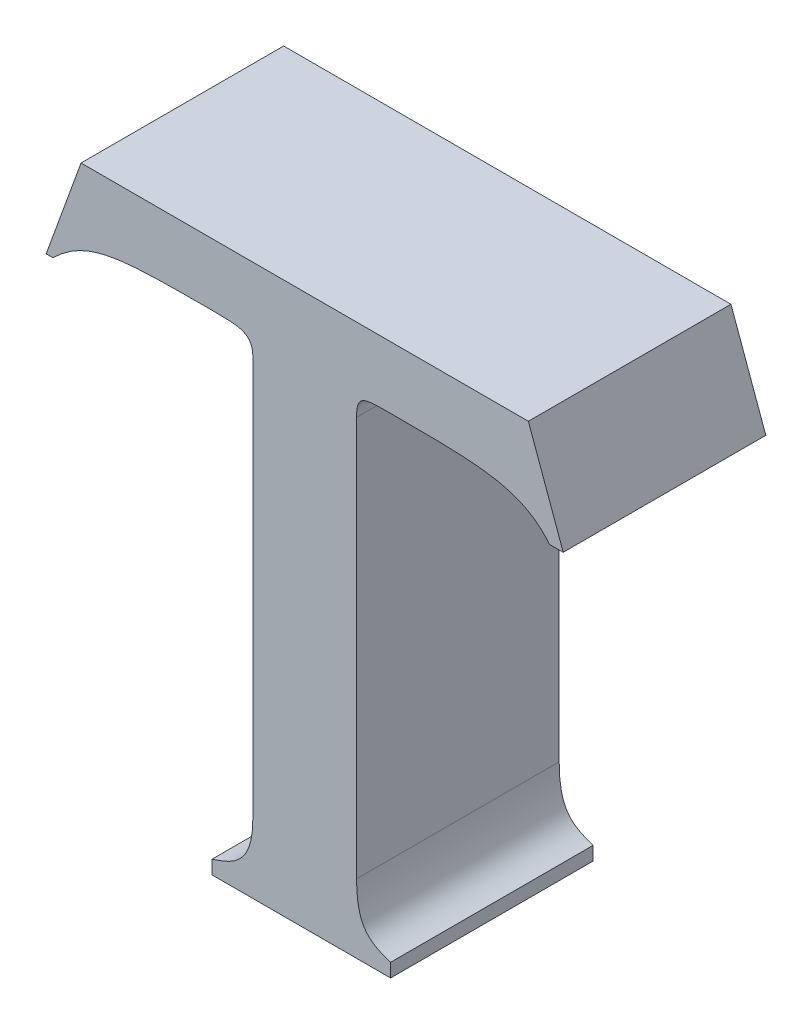
ISO-10303-21;
HEADER;
FILE_DESCRIPTION(('STEP AP214'),'2;1');
FILE_NAME('part.step','',(''),(''),'','','');
FILE_SCHEMA(('AUTOMOTIVE_DESIGN { 1 0 10303 214 1 1 1 1 }'));
ENDSEC;
DATA;
#1=APPLICATION_CONTEXT('core data for automotive mechanical design processes');
#2=APPLICATION_PROTOCOL_DEFINITION('international standard','automotive_design',2000,#1);
#3=PRODUCT_CONTEXT('',#1,'mechanical');
#4=PRODUCT('Part','Part','',(#3));
#5=PRODUCT_RELATED_PRODUCT_CATEGORY('part','',(#4));
#6=PRODUCT_DEFINITION_FORMATION('','',#4);
#7=PRODUCT_DEFINITION_CONTEXT('part definition',#1,'design');
#8=PRODUCT_DEFINITION('design','',#6,#7);
#9=PRODUCT_DEFINITION_SHAPE('','',#8);
#10=(LENGTH_UNIT() NAMED_UNIT(*) SI_UNIT(.MILLI.,.METRE.));
#11=(NAMED_UNIT(*) PLANE_ANGLE_UNIT() SI_UNIT($,.RADIAN.));
#12=(NAMED_UNIT(*) SI_UNIT($,.STERADIAN.) SOLID_ANGLE_UNIT());
#13=UNCERTAINTY_MEASURE_WITH_UNIT(LENGTH_MEASURE(1.E-05),#10,'distance_accuracy_value','');
#14=(GEOMETRIC_REPRESENTATION_CONTEXT(3) GLOBAL_UNCERTAINTY_ASSIGNED_CONTEXT((#13)) GLOBAL_UNIT_ASSIGNED_CONTEXT((#10,
#11,#12)) REPRESENTATION_CONTEXT('',''));
#15=CARTESIAN_POINT('',(0.,0.,0.));
#16=DIRECTION('',(0.,0.,1.));
#17=DIRECTION('',(1.,0.,0.));
#18=AXIS2_PLACEMENT_3D('',#15,#16,#17);
#19=CARTESIAN_POINT('',(0.917393963354,-0.13959341000028,0.));
#20=CARTESIAN_POINT('',(0.917393963354,-0.13959341000028,0.1));
#21=CARTESIAN_POINT('',(0.907320270836,-0.13623558528189,0.));
#22=CARTESIAN_POINT('',(0.907320270836,-0.13623558528189,0.1));
#23=CARTESIAN_POINT('',(0.900604995735,-0.13287791653682,0.));
#24=CARTESIAN_POINT('',(0.900604995735,-0.13287791653682,0.1));
#25=CARTESIAN_POINT('',(0.900604995735,-0.11231186792928,0.));
#26=CARTESIAN_POINT('',(0.900604995735,-0.11231186792928,0.1));
#27=B_SPLINE_SURFACE_WITH_KNOTS('',3,1,((#19,#20),(#21,#22),(#23,#24),(#25,#26)),.UNSPECIFIED.,
.F.,.F.,.F.,(4,4),(2,2),(-1.,0.),(0.,0.01),.UNSPECIFIED.);
#28=CARTESIAN_POINT('',(0.900604995735,-0.11231186792928,0.));
#29=CARTESIAN_POINT('',(0.900604995735,-0.13287791653682,0.));
#30=CARTESIAN_POINT('',(0.907320270836,-0.13623558528189,0.));
#31=CARTESIAN_POINT('',(0.917393963354,-0.13959341000028,0.));
#32=B_SPLINE_CURVE_WITH_KNOTS('',3,(#28,#29,#30,#31),.UNSPECIFIED.,.F.,.F.,(4,4),(0.,1.),.UNSPECIFIED.);
#33=CARTESIAN_POINT('',(0.900604995735,-0.11231186792928,0.));
#34=VERTEX_POINT('',#33);
#35=CARTESIAN_POINT('',(0.917393963354,-0.13959341000028,0.));
#36=VERTEX_POINT('',#35);
#37=EDGE_CURVE('E11',#34,#36,#32,.T.);
#38=DIRECTION('',(0.,0.,1.));
#39=VECTOR('',#38,1.);
#40=CARTESIAN_POINT('',(0.900604995735,-0.11231186792928,0.));
#41=LINE('',#40,#39);
#42=CARTESIAN_POINT('',(0.900604995735,-0.11231186792928,0.1));
#43=VERTEX_POINT('',#42);
#44=EDGE_CURVE('E28',#34,#43,#41,.T.);
#45=CARTESIAN_POINT('',(0.917393963354,-0.13959341000028,0.1));
#46=CARTESIAN_POINT('',(0.907320270836,-0.13623558528189,0.1));
#47=CARTESIAN_POINT('',(0.900604995735,-0.13287791653682,0.1));
#48=CARTESIAN_POINT('',(0.900604995735,-0.11231186792928,0.1));
#49=B_SPLINE_CURVE_WITH_KNOTS('',3,(#45,#46,#47,#48),.UNSPECIFIED.,.F.,.F.,(4,4),(-1.,0.),.UNSPECIFIED.);
#50=CARTESIAN_POINT('',(0.917393963354,-0.13959341000028,0.1));
#51=VERTEX_POINT('',#50);
#52=EDGE_CURVE('E152',#51,#43,#49,.T.);
#53=DIRECTION('',(0.,0.,1.));
#54=VECTOR('',#53,1.);
#55=CARTESIAN_POINT('',(0.917393963354,-0.13959341000028,0.));
#56=LINE('',#55,#54);
#57=EDGE_CURVE('E307',#36,#51,#56,.T.);
#58=ORIENTED_EDGE('',*,*,#37,.F.);
#59=ORIENTED_EDGE('',*,*,#44,.T.);
#60=ORIENTED_EDGE('',*,*,#52,.F.);
#61=ORIENTED_EDGE('',*,*,#57,.F.);
#62=EDGE_LOOP('',(#58,#59,#60,#61));
#63=FACE_BOUND('',#62,.T.);
#64=ADVANCED_FACE('F17',(#63),#27,.T.);
#65=CARTESIAN_POINT('',(0.917393963354,-0.14630890346375,0.));
#66=DIRECTION('',(1.,0.,0.));
#67=DIRECTION('',(0.,1.,0.));
#68=AXIS2_PLACEMENT_3D('',#65,#66,#67);
#69=PLANE('',#68);
#70=DIRECTION('',(0.,-1.,0.));
#71=VECTOR('',#70,1.);
#72=CARTESIAN_POINT('',(0.917393963354,-0.13959341000028,0.));
#73=LINE('',#72,#71);
#74=CARTESIAN_POINT('',(0.917393963354,-0.14630890346375,0.));
#75=VERTEX_POINT('',#74);
#76=EDGE_CURVE('E305',#36,#75,#73,.T.);
#77=ORIENTED_EDGE('',*,*,#76,.F.);
#78=ORIENTED_EDGE('',*,*,#57,.T.);
#79=DIRECTION('',(0.,1.,0.));
#80=VECTOR('',#79,1.);
#81=CARTESIAN_POINT('',(0.917393963354,-0.13959341000028,0.1));
#82=LINE('',#81,#80);
#83=CARTESIAN_POINT('',(0.917393963354,-0.14630890346375,0.1));
#84=VERTEX_POINT('',#83);
#85=EDGE_CURVE('E303',#84,#51,#82,.T.);
#86=ORIENTED_EDGE('',*,*,#85,.F.);
#87=DIRECTION('',(0.,0.,1.));
#88=VECTOR('',#87,1.);
#89=CARTESIAN_POINT('',(0.917393963354,-0.14630890346375,0.));
#90=LINE('',#89,#88);
#91=EDGE_CURVE('E300',#75,#84,#90,.T.);
#92=ORIENTED_EDGE('',*,*,#91,.F.);
#93=EDGE_LOOP('',(#77,#78,#86,#92));
#94=FACE_BOUND('',#93,.T.);
#95=ADVANCED_FACE('F366',(#94),#69,.T.);
#96=CARTESIAN_POINT('',(0.829252819196,-0.14630890346375,0.));
#97=DIRECTION('',(0.,-1.,0.));
#98=DIRECTION('',(1.,0.,0.));
#99=AXIS2_PLACEMENT_3D('',#96,#97,#98);
#100=PLANE('',#99);
#101=DIRECTION('',(-1.,0.,0.));
#102=VECTOR('',#101,1.);
#103=CARTESIAN_POINT('',(0.917393963354,-0.14630890346375,0.));
#104=LINE('',#103,#102);
#105=CARTESIAN_POINT('',(0.829252819196,-0.14630890346375,0.));
#106=VERTEX_POINT('',#105);
#107=EDGE_CURVE('E298',#75,#106,#104,.T.);
#108=ORIENTED_EDGE('',*,*,#107,.F.);
#109=ORIENTED_EDGE('',*,*,#91,.T.);
#110=DIRECTION('',(1.,0.,0.));
#111=VECTOR('',#110,1.);
#112=CARTESIAN_POINT('',(0.917393963354,-0.14630890346375,0.1));
#113=LINE('',#112,#111);
#114=CARTESIAN_POINT('',(0.829252819196,-0.14630890346375,0.1));
#115=VERTEX_POINT('',#114);
#116=EDGE_CURVE('E295',#115,#84,#113,.T.);
#117=ORIENTED_EDGE('',*,*,#116,.F.);
#118=DIRECTION('',(0.,0.,1.));
#119=VECTOR('',#118,1.);
#120=CARTESIAN_POINT('',(0.829252819196,-0.14630890346375,0.));
#121=LINE('',#120,#119);
#122=EDGE_CURVE('E292',#106,#115,#121,.T.);
#123=ORIENTED_EDGE('',*,*,#122,.F.);
#124=EDGE_LOOP('',(#108,#109,#117,#123));
#125=FACE_BOUND('',#124,.T.);
#126=ADVANCED_FACE('F362',(#125),#100,.T.);
#127=CARTESIAN_POINT('',(0.829252819196,-0.13959341000028,0.));
#128=DIRECTION('',(-1.,0.,0.));
#129=DIRECTION('',(0.,-1.,0.));
#130=AXIS2_PLACEMENT_3D('',#127,#128,#129);
#131=PLANE('',#130);
#132=DIRECTION('',(0.,1.,0.));
#133=VECTOR('',#132,1.);
#134=CARTESIAN_POINT('',(0.829252819196,-0.14630890346375,0.));
#135=LINE('',#134,#133);
#136=CARTESIAN_POINT('',(0.829252819196,-0.13959341000028,0.));
#137=VERTEX_POINT('',#136);
#138=EDGE_CURVE('E290',#106,#137,#135,.T.);
#139=ORIENTED_EDGE('',*,*,#138,.F.);
#140=ORIENTED_EDGE('',*,*,#122,.T.);
#141=DIRECTION('',(0.,-1.,0.));
#142=VECTOR('',#141,1.);
#143=CARTESIAN_POINT('',(0.829252819196,-0.14630890346375,0.1));
#144=LINE('',#143,#142);
#145=CARTESIAN_POINT('',(0.829252819196,-0.13959341000028,0.1));
#146=VERTEX_POINT('',#145);
#147=EDGE_CURVE('E287',#146,#115,#144,.T.);
#148=ORIENTED_EDGE('',*,*,#147,.F.);
#149=DIRECTION('',(0.,0.,1.));
#150=VECTOR('',#149,1.);
#151=CARTESIAN_POINT('',(0.829252819196,-0.13959341000028,0.));
#152=LINE('',#151,#150);
#153=EDGE_CURVE('E281',#137,#146,#152,.T.);
#154=ORIENTED_EDGE('',*,*,#153,.F.);
#155=EDGE_LOOP('',(#139,#140,#148,#154));
#156=FACE_BOUND('',#155,.T.);
#157=ADVANCED_FACE('F358',(#156),#131,.T.);
#158=CARTESIAN_POINT('',(0.849400204231,-0.11231186792928,0.));
#159=CARTESIAN_POINT('',(0.849400204231,-0.11231186792928,0.1));
#160=CARTESIAN_POINT('',(0.849400204231,-0.13287791653682,0.));
#161=CARTESIAN_POINT('',(0.849400204231,-0.13287791653682,0.1));
#162=CARTESIAN_POINT('',(0.839326511714,-0.13623558528189,0.));
#163=CARTESIAN_POINT('',(0.839326511714,-0.13623558528189,0.1));
#164=CARTESIAN_POINT('',(0.829252819196,-0.13959341000028,0.));
#165=CARTESIAN_POINT('',(0.829252819196,-0.13959341000028,0.1));
#166=B_SPLINE_SURFACE_WITH_KNOTS('',3,1,((#158,#159),(#160,#161),(#162,#163),(#164,#165)),
.UNSPECIFIED.,.F.,.F.,.F.,(4,4),(2,2),(-1.,0.),(0.,0.01),.UNSPECIFIED.);
#167=CARTESIAN_POINT('',(0.829252819196,-0.13959341000028,0.));
#168=CARTESIAN_POINT('',(0.839326511714,-0.13623558528189,0.));
#169=CARTESIAN_POINT('',(0.849400204231,-0.13287791653682,0.));
#170=CARTESIAN_POINT('',(0.849400204231,-0.11231186792928,0.));
#171=B_SPLINE_CURVE_WITH_KNOTS('',3,(#167,#168,#169,#170),.UNSPECIFIED.,.F.,.F.,(4,4),(0.,1.),.UNSPECIFIED.);
#172=CARTESIAN_POINT('',(0.849400204231,-0.11231186792928,0.));
#173=VERTEX_POINT('',#172);
#174=EDGE_CURVE('E274',#137,#173,#171,.T.);
#175=CARTESIAN_POINT('',(0.849400204231,-0.11231186792928,0.1));
#176=CARTESIAN_POINT('',(0.849400204231,-0.13287791653682,0.1));
#177=CARTESIAN_POINT('',(0.839326511714,-0.13623558528189,0.1));
#178=CARTESIAN_POINT('',(0.829252819196,-0.13959341000028,0.1));
#179=B_SPLINE_CURVE_WITH_KNOTS('',3,(#175,#176,#177,#178),.UNSPECIFIED.,.F.,.F.,(4,4),(-1.,0.),.UNSPECIFIED.);
#180=CARTESIAN_POINT('',(0.849400204231,-0.11231186792928,0.1));
#181=VERTEX_POINT('',#180);
#182=EDGE_CURVE('E269',#181,#146,#179,.T.);
#183=DIRECTION('',(0.,0.,1.));
#184=VECTOR('',#183,1.);
#185=CARTESIAN_POINT('',(0.849400204231,-0.11231186792928,0.));
#186=LINE('',#185,#184);
#187=EDGE_CURVE('E266',#173,#181,#186,.T.);
#188=ORIENTED_EDGE('',*,*,#174,.F.);
#189=ORIENTED_EDGE('',*,*,#153,.T.);
#190=ORIENTED_EDGE('',*,*,#182,.F.);
#191=ORIENTED_EDGE('',*,*,#187,.F.);
#192=EDGE_LOOP('',(#188,#189,#190,#191));
#193=FACE_BOUND('',#192,.T.);
#194=ADVANCED_FACE('F354',(#193),#166,.T.);
#195=CARTESIAN_POINT('',(0.849400204231,0.084954976593,0.));
#196=DIRECTION('',(-1.,0.,0.));
#197=DIRECTION('',(0.,-1.,0.));
#198=AXIS2_PLACEMENT_3D('',#195,#196,#197);
#199=PLANE('',#198);
#200=DIRECTION('',(0.,1.,0.));
#201=VECTOR('',#200,1.);
#202=CARTESIAN_POINT('',(0.849400204231,-0.11231186792928,0.));
#203=LINE('',#202,#201);
#204=CARTESIAN_POINT('',(0.849400204231,0.084954976593,0.));
#205=VERTEX_POINT('',#204);
#206=EDGE_CURVE('E264',#173,#205,#203,.T.);
#207=ORIENTED_EDGE('',*,*,#206,.F.);
#208=ORIENTED_EDGE('',*,*,#187,.T.);
#209=DIRECTION('',(0.,-1.,0.));
#210=VECTOR('',#209,1.);
#211=CARTESIAN_POINT('',(0.849400204231,-0.11231186792928,0.1));
#212=LINE('',#211,#210);
#213=CARTESIAN_POINT('',(0.849400204231,0.084954976593,0.1));
#214=VERTEX_POINT('',#213);
#215=EDGE_CURVE('E261',#214,#181,#212,.T.);
#216=ORIENTED_EDGE('',*,*,#215,.F.);
#217=DIRECTION('',(0.,0.,1.));
#218=VECTOR('',#217,1.);
#219=CARTESIAN_POINT('',(0.849400204231,0.084954976593,0.));
#220=LINE('',#219,#218);
#221=EDGE_CURVE('E255',#205,#214,#220,.T.);
#222=ORIENTED_EDGE('',*,*,#221,.F.);
#223=EDGE_LOOP('',(#207,#208,#216,#222));
#224=FACE_BOUND('',#223,.T.);
#225=ADVANCED_FACE('F350',(#224),#199,.T.);
#226=CARTESIAN_POINT('',(0.829252819196,0.0950281388010001,0.));
#227=CARTESIAN_POINT('',(0.829252819196,0.0950281388010001,0.1));
#228=CARTESIAN_POINT('',(0.842684617184,0.0950281388010001,0.));
#229=CARTESIAN_POINT('',(0.842684617184,0.0950281388010001,0.1));
#230=CARTESIAN_POINT('',(0.849400204231,0.0950281388010001,0.));
#231=CARTESIAN_POINT('',(0.849400204231,0.0950281388010001,0.1));
#232=CARTESIAN_POINT('',(0.849400204231,0.084954976593,0.));
#233=CARTESIAN_POINT('',(0.849400204231,0.084954976593,0.1));
#234=B_SPLINE_SURFACE_WITH_KNOTS('',3,1,((#226,#227),(#228,#229),(#230,#231),(#232,#233)),
.UNSPECIFIED.,.F.,.F.,.F.,(4,4),(2,2),(-1.,0.),(0.,0.01),.UNSPECIFIED.);
#235=CARTESIAN_POINT('',(0.849400204231,0.084954976593,0.));
#236=CARTESIAN_POINT('',(0.849400204231,0.0950281388010001,0.));
#237=CARTESIAN_POINT('',(0.842684617184,0.0950281388010001,0.));
#238=CARTESIAN_POINT('',(0.829252819196,0.0950281388010001,0.));
#239=B_SPLINE_CURVE_WITH_KNOTS('',3,(#235,#236,#237,#238),.UNSPECIFIED.,.F.,.F.,(4,4),(0.,1.),.UNSPECIFIED.);
#240=CARTESIAN_POINT('',(0.829252819196,0.0950281388010001,0.));
#241=VERTEX_POINT('',#240);
#242=EDGE_CURVE('E248',#205,#241,#239,.T.);
#243=CARTESIAN_POINT('',(0.829252819196,0.0950281388010001,0.1));
#244=CARTESIAN_POINT('',(0.842684617184,0.0950281388010001,0.1));
#245=CARTESIAN_POINT('',(0.849400204231,0.0950281388010001,0.1));
#246=CARTESIAN_POINT('',(0.849400204231,0.084954976593,0.1));
#247=B_SPLINE_CURVE_WITH_KNOTS('',3,(#243,#244,#245,#246),.UNSPECIFIED.,.F.,.F.,(4,4),(-1.,0.),.UNSPECIFIED.);
#248=CARTESIAN_POINT('',(0.829252819196,0.0950281388010001,0.1));
#249=VERTEX_POINT('',#248);
#250=EDGE_CURVE('E243',#249,#214,#247,.T.);
#251=DIRECTION('',(0.,0.,1.));
#252=VECTOR('',#251,1.);
#253=CARTESIAN_POINT('',(0.829252819196,0.0950281388010001,0.));
#254=LINE('',#253,#252);
#255=EDGE_CURVE('E237',#241,#249,#254,.T.);
#256=ORIENTED_EDGE('',*,*,#242,.F.);
#257=ORIENTED_EDGE('',*,*,#221,.T.);
#258=ORIENTED_EDGE('',*,*,#250,.F.);
#259=ORIENTED_EDGE('',*,*,#255,.F.);
#260=EDGE_LOOP('',(#256,#257,#258,#259));
#261=FACE_BOUND('',#260,.T.);
#262=ADVANCED_FACE('F346',(#261),#234,.T.);
#263=CARTESIAN_POINT('',(0.750766423232,0.078239483129,0.));
#264=CARTESIAN_POINT('',(0.750766423232,0.078239483129,0.1));
#265=CARTESIAN_POINT('',(0.767974335174,0.0950281388010002,0.));
#266=CARTESIAN_POINT('',(0.767974335174,0.0950281388010002,0.1));
#267=CARTESIAN_POINT('',(0.784763302793,0.0950281388010001,0.));
#268=CARTESIAN_POINT('',(0.784763302793,0.0950281388010001,0.1));
#269=CARTESIAN_POINT('',(0.829252819196,0.0950281388010001,0.));
#270=CARTESIAN_POINT('',(0.829252819196,0.0950281388010001,0.1));
#271=B_SPLINE_SURFACE_WITH_KNOTS('',3,1,((#263,#264),(#265,#266),(#267,#268),(#269,#270)),
.UNSPECIFIED.,.F.,.F.,.F.,(4,4),(2,2),(-1.,0.),(0.,0.01),.UNSPECIFIED.);
#272=CARTESIAN_POINT('',(0.829252819196,0.0950281388010001,0.));
#273=CARTESIAN_POINT('',(0.784763302793,0.0950281388010001,0.));
#274=CARTESIAN_POINT('',(0.767974335174,0.0950281388010002,0.));
#275=CARTESIAN_POINT('',(0.750766423232,0.078239483129,0.));
#276=B_SPLINE_CURVE_WITH_KNOTS('',3,(#272,#273,#274,#275),.UNSPECIFIED.,.F.,.F.,(4,4),(0.,1.),.UNSPECIFIED.);
#277=CARTESIAN_POINT('',(0.750766423232,0.078239483129,0.));
#278=VERTEX_POINT('',#277);
#279=EDGE_CURVE('E230',#241,#278,#276,.T.);
#280=CARTESIAN_POINT('',(0.750766423232,0.078239483129,0.1));
#281=CARTESIAN_POINT('',(0.767974335174,0.0950281388010002,0.1));
#282=CARTESIAN_POINT('',(0.784763302793,0.0950281388010001,0.1));
#283=CARTESIAN_POINT('',(0.829252819196,0.0950281388010001,0.1));
#284=B_SPLINE_CURVE_WITH_KNOTS('',3,(#280,#281,#282,#283),.UNSPECIFIED.,.F.,.F.,(4,4),(-1.,0.),.UNSPECIFIED.);
#285=CARTESIAN_POINT('',(0.750766423232,0.078239483129,0.1));
#286=VERTEX_POINT('',#285);
#287=EDGE_CURVE('E225',#286,#249,#284,.T.);
#288=DIRECTION('',(0.,0.,1.));
#289=VECTOR('',#288,1.);
#290=CARTESIAN_POINT('',(0.750766423232,0.078239483129,0.));
#291=LINE('',#290,#289);
#292=EDGE_CURVE('E222',#278,#286,#291,.T.);
#293=ORIENTED_EDGE('',*,*,#279,.F.);
#294=ORIENTED_EDGE('',*,*,#255,.T.);
#295=ORIENTED_EDGE('',*,*,#287,.F.);
#296=ORIENTED_EDGE('',*,*,#292,.F.);
#297=EDGE_LOOP('',(#293,#294,#295,#296));
#298=FACE_BOUND('',#297,.T.);
#299=ADVANCED_FACE('F342',(#298),#271,.T.);
#300=CARTESIAN_POINT('',(0.747408005815,0.078239483129,0.));
#301=DIRECTION('',(0.,-1.,0.));
#302=DIRECTION('',(1.,0.,0.));
#303=AXIS2_PLACEMENT_3D('',#300,#301,#302);
#304=PLANE('',#303);
#305=DIRECTION('',(-1.,0.,0.));
#306=VECTOR('',#305,1.);
#307=CARTESIAN_POINT('',(0.750766423232,0.078239483129,0.));
#308=LINE('',#307,#306);
#309=CARTESIAN_POINT('',(0.747408005815,0.078239483129,0.));
#310=VERTEX_POINT('',#309);
#311=EDGE_CURVE('E220',#278,#310,#308,.T.);
#312=ORIENTED_EDGE('',*,*,#311,.F.);
#313=ORIENTED_EDGE('',*,*,#292,.T.);
#314=DIRECTION('',(1.,0.,0.));
#315=VECTOR('',#314,1.);
#316=CARTESIAN_POINT('',(0.750766423232,0.078239483129,0.1));
#317=LINE('',#316,#315);
#318=CARTESIAN_POINT('',(0.747408005815,0.078239483129,0.1));
#319=VERTEX_POINT('',#318);
#320=EDGE_CURVE('E217',#319,#286,#317,.T.);
#321=ORIENTED_EDGE('',*,*,#320,.F.);
#322=DIRECTION('',(0.,0.,1.));
#323=VECTOR('',#322,1.);
#324=CARTESIAN_POINT('',(0.747408005815,0.078239483129,0.));
#325=LINE('',#324,#323);
#326=EDGE_CURVE('E214',#310,#319,#325,.T.);
#327=ORIENTED_EDGE('',*,*,#326,.F.);
#328=EDGE_LOOP('',(#312,#313,#321,#327));
#329=FACE_BOUND('',#328,.T.);
#330=ADVANCED_FACE('F338',(#329),#304,.T.);
#331=CARTESIAN_POINT('',(0.764617165544,0.125667474396,0.));
#332=DIRECTION('',(-0.940031158167793,0.341088583323625,0.));
#333=DIRECTION('',(-0.341088583323625,-0.940031158167793,0.));
#334=AXIS2_PLACEMENT_3D('',#331,#332,#333);
#335=PLANE('',#334);
#336=DIRECTION('',(0.341088583323625,0.940031158167793,0.));
#337=VECTOR('',#336,1.);
#338=CARTESIAN_POINT('',(0.747408005815,0.078239483129,0.));
#339=LINE('',#338,#337);
#340=CARTESIAN_POINT('',(0.764617165544,0.125667474396,0.));
#341=VERTEX_POINT('',#340);
#342=EDGE_CURVE('E212',#310,#341,#339,.T.);
#343=ORIENTED_EDGE('',*,*,#342,.F.);
#344=ORIENTED_EDGE('',*,*,#326,.T.);
#345=DIRECTION('',(-0.341088583323625,-0.940031158167793,0.));
#346=VECTOR('',#345,1.);
#347=CARTESIAN_POINT('',(0.747408005815,0.078239483129,0.1));
#348=LINE('',#347,#346);
#349=CARTESIAN_POINT('',(0.764617165544,0.125667474396,0.1));
#350=VERTEX_POINT('',#349);
#351=EDGE_CURVE('E209',#350,#319,#348,.T.);
#352=ORIENTED_EDGE('',*,*,#351,.F.);
#353=DIRECTION('',(0.,0.,1.));
#354=VECTOR('',#353,1.);
#355=CARTESIAN_POINT('',(0.764617165544,0.125667474396,0.));
#356=LINE('',#355,#354);
#357=EDGE_CURVE('E206',#341,#350,#356,.T.);
#358=ORIENTED_EDGE('',*,*,#357,.F.);
#359=EDGE_LOOP('',(#343,#344,#352,#358));
#360=FACE_BOUND('',#359,.T.);
#361=ADVANCED_FACE('F334',(#360),#335,.T.);
#362=CARTESIAN_POINT('',(0.985387722476,0.125667474396,0.));
#363=DIRECTION('',(0.,1.,0.));
#364=DIRECTION('',(-1.,0.,0.));
#365=AXIS2_PLACEMENT_3D('',#362,#363,#364);
#366=PLANE('',#365);
#367=DIRECTION('',(1.,0.,0.));
#368=VECTOR('',#367,1.);
#369=CARTESIAN_POINT('',(0.764617165544,0.125667474396,0.));
#370=LINE('',#369,#368);
#371=CARTESIAN_POINT('',(0.985387722476,0.125667474396,0.));
#372=VERTEX_POINT('',#371);
#373=EDGE_CURVE('E204',#341,#372,#370,.T.);
#374=ORIENTED_EDGE('',*,*,#373,.F.);
#375=ORIENTED_EDGE('',*,*,#357,.T.);
#376=DIRECTION('',(-1.,0.,0.));
#377=VECTOR('',#376,1.);
#378=CARTESIAN_POINT('',(0.764617165544,0.125667474396,0.1));
#379=LINE('',#378,#377);
#380=CARTESIAN_POINT('',(0.985387722476,0.125667474396,0.1));
#381=VERTEX_POINT('',#380);
#382=EDGE_CURVE('E201',#381,#350,#379,.T.);
#383=ORIENTED_EDGE('',*,*,#382,.F.);
#384=DIRECTION('',(0.,0.,1.));
#385=VECTOR('',#384,1.);
#386=CARTESIAN_POINT('',(0.985387722476,0.125667474396,0.));
#387=LINE('',#386,#385);
#388=EDGE_CURVE('E198',#372,#381,#387,.T.);
#389=ORIENTED_EDGE('',*,*,#388,.F.);
#390=EDGE_LOOP('',(#374,#375,#383,#389));
#391=FACE_BOUND('',#390,.T.);
#392=ADVANCED_FACE('F330',(#391),#366,.T.);
#393=CARTESIAN_POINT('',(1.002595634419,0.078239483129,0.));
#394=DIRECTION('',(0.940039087686144,0.341066728987455,0.));
#395=DIRECTION('',(-0.341066728987455,0.940039087686144,0.));
#396=AXIS2_PLACEMENT_3D('',#393,#394,#395);
#397=PLANE('',#396);
#398=DIRECTION('',(0.341066728987455,-0.940039087686144,0.));
#399=VECTOR('',#398,1.);
#400=CARTESIAN_POINT('',(0.985387722476,0.125667474396,0.));
#401=LINE('',#400,#399);
#402=CARTESIAN_POINT('',(1.002595634419,0.078239483129,0.));
#403=VERTEX_POINT('',#402);
#404=EDGE_CURVE('E196',#372,#403,#401,.T.);
#405=ORIENTED_EDGE('',*,*,#404,.F.);
#406=ORIENTED_EDGE('',*,*,#388,.T.);
#407=DIRECTION('',(-0.341066728987455,0.940039087686144,0.));
#408=VECTOR('',#407,1.);
#409=CARTESIAN_POINT('',(0.985387722476,0.125667474396,0.1));
#410=LINE('',#409,#408);
#411=CARTESIAN_POINT('',(1.002595634419,0.078239483129,0.1));
#412=VERTEX_POINT('',#411);
#413=EDGE_CURVE('E193',#412,#381,#410,.T.);
#414=ORIENTED_EDGE('',*,*,#413,.F.);
#415=DIRECTION('',(0.,0.,1.));
#416=VECTOR('',#415,1.);
#417=CARTESIAN_POINT('',(1.002595634419,0.078239483129,0.));
#418=LINE('',#417,#416);
#419=EDGE_CURVE('E190',#403,#412,#418,.T.);
#420=ORIENTED_EDGE('',*,*,#419,.F.);
#421=EDGE_LOOP('',(#405,#406,#414,#420));
#422=FACE_BOUND('',#421,.T.);
#423=ADVANCED_FACE('F326',(#422),#397,.T.);
#424=CARTESIAN_POINT('',(0.995880359318,0.078239483129,0.));
#425=DIRECTION('',(0.,-1.,0.));
#426=DIRECTION('',(1.,0.,0.));
#427=AXIS2_PLACEMENT_3D('',#424,#425,#426);
#428=PLANE('',#427);
#429=DIRECTION('',(-1.,0.,0.));
#430=VECTOR('',#429,1.);
#431=CARTESIAN_POINT('',(1.002595634419,0.078239483129,0.));
#432=LINE('',#431,#430);
#433=CARTESIAN_POINT('',(0.995880359318,0.078239483129,0.));
#434=VERTEX_POINT('',#433);
#435=EDGE_CURVE('E188',#403,#434,#432,.T.);
#436=ORIENTED_EDGE('',*,*,#435,.F.);
#437=ORIENTED_EDGE('',*,*,#419,.T.);
#438=DIRECTION('',(1.,0.,0.));
#439=VECTOR('',#438,1.);
#440=CARTESIAN_POINT('',(1.002595634419,0.078239483129,0.1));
#441=LINE('',#440,#439);
#442=CARTESIAN_POINT('',(0.995880359318,0.078239483129,0.1));
#443=VERTEX_POINT('',#442);
#444=EDGE_CURVE('E185',#443,#412,#441,.T.);
#445=ORIENTED_EDGE('',*,*,#444,.F.);
#446=DIRECTION('',(0.,0.,1.));
#447=VECTOR('',#446,1.);
#448=CARTESIAN_POINT('',(0.995880359318,0.078239483129,0.));
#449=LINE('',#448,#447);
#450=EDGE_CURVE('E179',#434,#443,#449,.T.);
#451=ORIENTED_EDGE('',*,*,#450,.F.);
#452=EDGE_LOOP('',(#436,#437,#445,#451));
#453=FACE_BOUND('',#452,.T.);
#454=ADVANCED_FACE('F322',(#453),#428,.T.);
#455=CARTESIAN_POINT('',(0.917393963354,0.0950281388010001,0.));
#456=CARTESIAN_POINT('',(0.917393963354,0.0950281388010001,0.1));
#457=CARTESIAN_POINT('',(0.96188316781,0.0950281388010001,0.));
#458=CARTESIAN_POINT('',(0.96188316781,0.0950281388010001,0.1));
#459=CARTESIAN_POINT('',(0.982029305059001,0.095028138801,0.));
#460=CARTESIAN_POINT('',(0.982029305059001,0.095028138801,0.1));
#461=CARTESIAN_POINT('',(0.995880359318,0.078239483129,0.));
#462=CARTESIAN_POINT('',(0.995880359318,0.078239483129,0.1));
#463=B_SPLINE_SURFACE_WITH_KNOTS('',3,1,((#455,#456),(#457,#458),(#459,#460),(#461,#462)),
.UNSPECIFIED.,.F.,.F.,.F.,(4,4),(2,2),(-1.,0.),(0.,0.01),.UNSPECIFIED.);
#464=CARTESIAN_POINT('',(0.995880359318,0.078239483129,0.));
#465=CARTESIAN_POINT('',(0.982029305059001,0.095028138801,0.));
#466=CARTESIAN_POINT('',(0.96188316781,0.0950281388010001,0.));
#467=CARTESIAN_POINT('',(0.917393963354,0.0950281388010001,0.));
#468=B_SPLINE_CURVE_WITH_KNOTS('',3,(#464,#465,#466,#467),.UNSPECIFIED.,.F.,.F.,(4,4),(0.,1.),.UNSPECIFIED.);
#469=CARTESIAN_POINT('',(0.917393963354,0.0950281388010001,0.));
#470=VERTEX_POINT('',#469);
#471=EDGE_CURVE('E172',#434,#470,#468,.T.);
#472=CARTESIAN_POINT('',(0.917393963354,0.0950281388010001,0.1));
#473=CARTESIAN_POINT('',(0.96188316781,0.0950281388010001,0.1));
#474=CARTESIAN_POINT('',(0.982029305059001,0.095028138801,0.1));
#475=CARTESIAN_POINT('',(0.995880359318,0.078239483129,0.1));
#476=B_SPLINE_CURVE_WITH_KNOTS('',3,(#472,#473,#474,#475),.UNSPECIFIED.,.F.,.F.,(4,4),(-1.,0.),.UNSPECIFIED.);
#477=CARTESIAN_POINT('',(0.917393963354,0.0950281388010001,0.1));
#478=VERTEX_POINT('',#477);
#479=EDGE_CURVE('E168',#478,#443,#476,.T.);
#480=DIRECTION('',(0.,0.,1.));
#481=VECTOR('',#480,1.);
#482=CARTESIAN_POINT('',(0.917393963354,0.0950281388010001,0.));
#483=LINE('',#482,#481);
#484=EDGE_CURVE('E137',#470,#478,#483,.T.);
#485=ORIENTED_EDGE('',*,*,#471,.F.);
#486=ORIENTED_EDGE('',*,*,#450,.T.);
#487=ORIENTED_EDGE('',*,*,#479,.F.);
#488=ORIENTED_EDGE('',*,*,#484,.F.);
#489=EDGE_LOOP('',(#485,#486,#487,#488));
#490=FACE_BOUND('',#489,.T.);
#491=ADVANCED_FACE('F320',(#490),#463,.T.);
#492=CARTESIAN_POINT('',(0.900604995735,0.084954976593,0.));
#493=CARTESIAN_POINT('',(0.900604995735,0.084954976593,0.1));
#494=CARTESIAN_POINT('',(0.900604995735,0.0950281388009995,0.));
#495=CARTESIAN_POINT('',(0.900604995735,0.0950281388009995,0.1));
#496=CARTESIAN_POINT('',(0.903963101205001,0.0950281388009994,0.));
#497=CARTESIAN_POINT('',(0.903963101205001,0.0950281388009994,0.1));
#498=CARTESIAN_POINT('',(0.917393963354,0.0950281388010001,0.));
#499=CARTESIAN_POINT('',(0.917393963354,0.0950281388010001,0.1));
#500=B_SPLINE_SURFACE_WITH_KNOTS('',3,1,((#492,#493),(#494,#495),(#496,#497),(#498,#499)),
.UNSPECIFIED.,.F.,.F.,.F.,(4,4),(2,2),(-1.,0.),(0.,0.01),.UNSPECIFIED.);
#501=CARTESIAN_POINT('',(0.917393963354,0.0950281388010001,0.));
#502=CARTESIAN_POINT('',(0.903963101205001,0.0950281388009994,0.));
#503=CARTESIAN_POINT('',(0.900604995735,0.0950281388009995,0.));
#504=CARTESIAN_POINT('',(0.900604995735,0.084954976593,0.));
#505=B_SPLINE_CURVE_WITH_KNOTS('',3,(#501,#502,#503,#504),.UNSPECIFIED.,.F.,.F.,(4,4),(0.,1.),.UNSPECIFIED.);
#506=CARTESIAN_POINT('',(0.900604995735,0.084954976593,0.));
#507=VERTEX_POINT('',#506);
#508=EDGE_CURVE('E141',#470,#507,#505,.T.);
#509=CARTESIAN_POINT('',(0.900604995735,0.084954976593,0.1));
#510=CARTESIAN_POINT('',(0.900604995735,0.0950281388009995,0.1));
#511=CARTESIAN_POINT('',(0.903963101205001,0.0950281388009994,0.1));
#512=CARTESIAN_POINT('',(0.917393963354,0.0950281388010001,0.1));
#513=B_SPLINE_CURVE_WITH_KNOTS('',3,(#509,#510,#511,#512),.UNSPECIFIED.,.F.,.F.,(4,4),(-1.,0.),.UNSPECIFIED.);
#514=CARTESIAN_POINT('',(0.900604995735,0.084954976593,0.1));
#515=VERTEX_POINT('',#514);
#516=EDGE_CURVE('E130',#515,#478,#513,.T.);
#517=DIRECTION('',(0.,0.,1.));
#518=VECTOR('',#517,1.);
#519=CARTESIAN_POINT('',(0.900604995735,0.084954976593,0.));
#520=LINE('',#519,#518);
#521=EDGE_CURVE('E134',#507,#515,#520,.T.);
#522=ORIENTED_EDGE('',*,*,#508,.F.);
#523=ORIENTED_EDGE('',*,*,#484,.T.);
#524=ORIENTED_EDGE('',*,*,#516,.F.);
#525=ORIENTED_EDGE('',*,*,#521,.F.);
#526=EDGE_LOOP('',(#522,#523,#524,#525));
#527=FACE_BOUND('',#526,.T.);
#528=ADVANCED_FACE('F133',(#527),#500,.T.);
#529=CARTESIAN_POINT('',(0.900604995735,-0.11231186792928,0.));
#530=DIRECTION('',(1.,0.,0.));
#531=DIRECTION('',(0.,1.,0.));
#532=AXIS2_PLACEMENT_3D('',#529,#530,#531);
#533=PLANE('',#532);
#534=DIRECTION('',(0.,-1.,0.));
#535=VECTOR('',#534,1.);
#536=CARTESIAN_POINT('',(0.900604995735,0.084954976593,0.));
#537=LINE('',#536,#535);
#538=EDGE_CURVE('E147',#507,#34,#537,.T.);
#539=ORIENTED_EDGE('',*,*,#538,.F.);
#540=ORIENTED_EDGE('',*,*,#521,.T.);
#541=DIRECTION('',(0.,1.,0.));
#542=VECTOR('',#541,1.);
#543=CARTESIAN_POINT('',(0.900604995735,0.084954976593,0.1));
#544=LINE('',#543,#542);
#545=EDGE_CURVE('E146',#43,#515,#544,.T.);
#546=ORIENTED_EDGE('',*,*,#545,.F.);
#547=ORIENTED_EDGE('',*,*,#44,.F.);
#548=EDGE_LOOP('',(#539,#540,#546,#547));
#549=FACE_BOUND('',#548,.T.);
#550=ADVANCED_FACE('F145',(#549),#533,.T.);
#551=CARTESIAN_POINT('',(0.874884428912086,0.0253389430309835,0.));
#552=DIRECTION('',(0.,0.,1.));
#553=DIRECTION('',(1.,0.,0.));
#554=AXIS2_PLACEMENT_3D('',#551,#552,#553);
#555=PLANE('',#554);
#556=ORIENTED_EDGE('',*,*,#538,.T.);
#557=ORIENTED_EDGE('',*,*,#37,.T.);
#558=ORIENTED_EDGE('',*,*,#76,.T.);
#559=ORIENTED_EDGE('',*,*,#107,.T.);
#560=ORIENTED_EDGE('',*,*,#138,.T.);
#561=ORIENTED_EDGE('',*,*,#174,.T.);
#562=ORIENTED_EDGE('',*,*,#206,.T.);
#563=ORIENTED_EDGE('',*,*,#242,.T.);
#564=ORIENTED_EDGE('',*,*,#279,.T.);
#565=ORIENTED_EDGE('',*,*,#311,.T.);
#566=ORIENTED_EDGE('',*,*,#342,.T.);
#567=ORIENTED_EDGE('',*,*,#373,.T.);
#568=ORIENTED_EDGE('',*,*,#404,.T.);
#569=ORIENTED_EDGE('',*,*,#435,.T.);
#570=ORIENTED_EDGE('',*,*,#471,.T.);
#571=ORIENTED_EDGE('',*,*,#508,.T.);
#572=EDGE_LOOP('',(#556,#557,#558,#559,#560,#561,#562,#563,#564,#565,#566,#567,#568,#569,#570,#571));
#573=FACE_BOUND('',#572,.T.);
#574=ADVANCED_FACE('F315',(#573),#555,.F.);
#575=CARTESIAN_POINT('',(0.874884428912086,0.0253389430309835,0.1));
#576=DIRECTION('',(0.,0.,1.));
#577=DIRECTION('',(1.,0.,0.));
#578=AXIS2_PLACEMENT_3D('',#575,#576,#577);
#579=PLANE('',#578);
#580=ORIENTED_EDGE('',*,*,#545,.T.);
#581=ORIENTED_EDGE('',*,*,#516,.T.);
#582=ORIENTED_EDGE('',*,*,#479,.T.);
#583=ORIENTED_EDGE('',*,*,#444,.T.);
#584=ORIENTED_EDGE('',*,*,#413,.T.);
#585=ORIENTED_EDGE('',*,*,#382,.T.);
#586=ORIENTED_EDGE('',*,*,#351,.T.);
#587=ORIENTED_EDGE('',*,*,#320,.T.);
#588=ORIENTED_EDGE('',*,*,#287,.T.);
#589=ORIENTED_EDGE('',*,*,#250,.T.);
#590=ORIENTED_EDGE('',*,*,#215,.T.);
#591=ORIENTED_EDGE('',*,*,#182,.T.);
#592=ORIENTED_EDGE('',*,*,#147,.T.);
#593=ORIENTED_EDGE('',*,*,#116,.T.);
#594=ORIENTED_EDGE('',*,*,#85,.T.);
#595=ORIENTED_EDGE('',*,*,#52,.T.);
#596=EDGE_LOOP('',(#580,#581,#582,#583,#584,#585,#586,#587,#588,#589,#590,#591,#592,#593,#594,#595));
#597=FACE_BOUND('',#596,.T.);
#598=ADVANCED_FACE('F150',(#597),#579,.T.);
#599=CLOSED_SHELL('',(#64,#95,#126,#157,#194,#225,#262,#299,#330,#361,#392,#423,#454,#491,#528,
#550,#574,#598));
#600=MANIFOLD_SOLID_BREP('B1',#599);
#601=ADVANCED_BREP_SHAPE_REPRESENTATION('',(#18,#600),#14);
#602=SHAPE_DEFINITION_REPRESENTATION(#9,#601);
ENDSEC;
END-ISO-10303-21;
